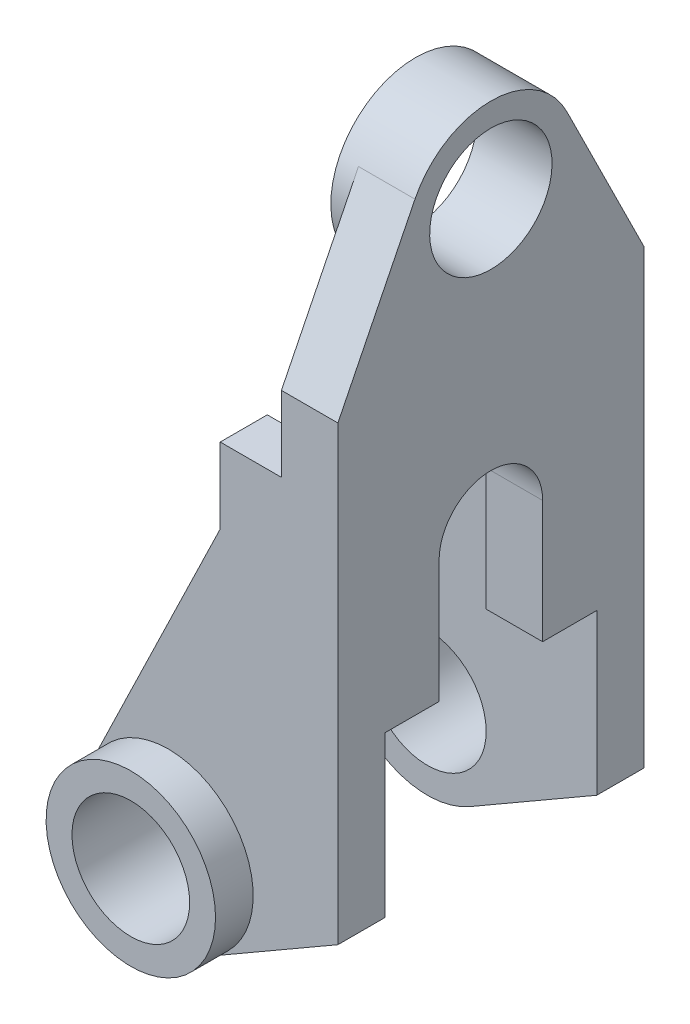
ISO-10303-21;
HEADER;
FILE_DESCRIPTION(('STEP AP214'),'2;1');
FILE_NAME('part.step','',(''),(''),'','','');
FILE_SCHEMA(('AUTOMOTIVE_DESIGN { 1 0 10303 214 1 1 1 1 }'));
ENDSEC;
DATA;
#1=APPLICATION_CONTEXT('core data for automotive mechanical design processes');
#2=APPLICATION_PROTOCOL_DEFINITION('international standard','automotive_design',2000,#1);
#3=PRODUCT_CONTEXT('',#1,'mechanical');
#4=PRODUCT('Part','Part','',(#3));
#5=PRODUCT_RELATED_PRODUCT_CATEGORY('part','',(#4));
#6=PRODUCT_DEFINITION_FORMATION('','',#4);
#7=PRODUCT_DEFINITION_CONTEXT('part definition',#1,'design');
#8=PRODUCT_DEFINITION('design','',#6,#7);
#9=PRODUCT_DEFINITION_SHAPE('','',#8);
#10=(LENGTH_UNIT() NAMED_UNIT(*) SI_UNIT(.MILLI.,.METRE.));
#11=(NAMED_UNIT(*) PLANE_ANGLE_UNIT() SI_UNIT($,.RADIAN.));
#12=(NAMED_UNIT(*) SI_UNIT($,.STERADIAN.) SOLID_ANGLE_UNIT());
#13=UNCERTAINTY_MEASURE_WITH_UNIT(LENGTH_MEASURE(1.E-05),#10,'distance_accuracy_value','');
#14=(GEOMETRIC_REPRESENTATION_CONTEXT(3) GLOBAL_UNCERTAINTY_ASSIGNED_CONTEXT((#13)) GLOBAL_UNIT_ASSIGNED_CONTEXT((#10,
#11,#12)) REPRESENTATION_CONTEXT('',''));
#15=CARTESIAN_POINT('',(0.,0.,0.));
#16=DIRECTION('',(0.,0.,1.));
#17=DIRECTION('',(1.,0.,0.));
#18=AXIS2_PLACEMENT_3D('',#15,#16,#17);
#19=CARTESIAN_POINT('',(27.1996168539313,72.1531908532306,5.));
#20=DIRECTION('',(0.,-1.,0.));
#21=DIRECTION('',(1.,0.,0.));
#22=AXIS2_PLACEMENT_3D('',#19,#20,#21);
#23=PLANE('',#22);
#24=DIRECTION('',(0.,0.,1.));
#25=VECTOR('',#24,1.);
#26=CARTESIAN_POINT('',(40.1996168539313,72.1531908532306,0.));
#27=LINE('',#26,#25);
#28=CARTESIAN_POINT('',(40.1996168539313,72.1531908532306,-5.));
#29=VERTEX_POINT('',#28);
#30=CARTESIAN_POINT('',(40.1996168539313,72.1531908532306,5.));
#31=VERTEX_POINT('',#30);
#32=EDGE_CURVE('E339',#29,#31,#27,.T.);
#33=ORIENTED_EDGE('',*,*,#32,.F.);
#34=DIRECTION('',(-1.,0.,0.));
#35=VECTOR('',#34,1.);
#36=CARTESIAN_POINT('',(27.1996168539313,72.1531908532306,-5.));
#37=LINE('',#36,#35);
#38=CARTESIAN_POINT('',(27.1996168539313,72.1531908532306,-5.));
#39=VERTEX_POINT('',#38);
#40=EDGE_CURVE('E421',#29,#39,#37,.T.);
#41=ORIENTED_EDGE('',*,*,#40,.T.);
#42=DIRECTION('',(0.,0.,-1.));
#43=VECTOR('',#42,1.);
#44=CARTESIAN_POINT('',(27.1996168539313,72.1531908532306,5.));
#45=LINE('',#44,#43);
#46=CARTESIAN_POINT('',(27.1996168539313,72.1531908532306,5.));
#47=VERTEX_POINT('',#46);
#48=EDGE_CURVE('E429',#47,#39,#45,.T.);
#49=ORIENTED_EDGE('',*,*,#48,.F.);
#50=DIRECTION('',(-1.,0.,0.));
#51=VECTOR('',#50,1.);
#52=CARTESIAN_POINT('',(27.1996168539313,72.1531908532306,5.));
#53=LINE('',#52,#51);
#54=EDGE_CURVE('E402',#31,#47,#53,.T.);
#55=ORIENTED_EDGE('',*,*,#54,.F.);
#56=EDGE_LOOP('',(#33,#41,#49,#55));
#57=FACE_BOUND('',#56,.T.);
#58=ADVANCED_FACE('F40',(#57),#23,.F.);
#59=CARTESIAN_POINT('',(27.1996168539313,56.1531908532306,5.));
#60=DIRECTION('',(0.899978714107295,-0.435933841487191,0.));
#61=DIRECTION('',(0.435933841487191,0.899978714107295,0.));
#62=AXIS2_PLACEMENT_3D('',#59,#60,#61);
#63=PLANE('',#62);
#64=DIRECTION('',(-0.435933841487191,-0.899978714107295,0.));
#65=VECTOR('',#64,1.);
#66=CARTESIAN_POINT('',(27.1996168539313,56.1531908532306,-5.));
#67=LINE('',#66,#65);
#68=CARTESIAN_POINT('',(27.1996168539313,56.1531908532306,-5.));
#69=VERTEX_POINT('',#68);
#70=CARTESIAN_POINT('',(0.,0.,-5.));
#71=VERTEX_POINT('',#70);
#72=EDGE_CURVE('E385',#69,#71,#67,.T.);
#73=ORIENTED_EDGE('',*,*,#72,.T.);
#74=DIRECTION('',(0.,0.,-1.));
#75=VECTOR('',#74,1.);
#76=CARTESIAN_POINT('',(0.,0.,5.));
#77=LINE('',#76,#75);
#78=CARTESIAN_POINT('',(0.,0.,5.));
#79=VERTEX_POINT('',#78);
#80=EDGE_CURVE('E390',#79,#71,#77,.T.);
#81=ORIENTED_EDGE('',*,*,#80,.F.);
#82=DIRECTION('',(-0.435933841487191,-0.899978714107295,0.));
#83=VECTOR('',#82,1.);
#84=CARTESIAN_POINT('',(27.1996168539313,56.1531908532306,5.));
#85=LINE('',#84,#83);
#86=CARTESIAN_POINT('',(27.1996168539313,56.1531908532306,5.));
#87=VERTEX_POINT('',#86);
#88=EDGE_CURVE('E391',#87,#79,#85,.T.);
#89=ORIENTED_EDGE('',*,*,#88,.F.);
#90=DIRECTION('',(0.,0.,-1.));
#91=VECTOR('',#90,1.);
#92=CARTESIAN_POINT('',(27.1996168539313,56.1531908532306,5.));
#93=LINE('',#92,#91);
#94=EDGE_CURVE('E408',#87,#69,#93,.T.);
#95=ORIENTED_EDGE('',*,*,#94,.T.);
#96=EDGE_LOOP('',(#73,#81,#89,#95));
#97=FACE_BOUND('',#96,.T.);
#98=ADVANCED_FACE('F42',(#97),#63,.F.);
#99=CARTESIAN_POINT('',(16.1996168539313,-7.84680914676944,5.));
#100=DIRECTION('',(0.,0.,-1.));
#101=DIRECTION('',(-1.,0.,0.));
#102=AXIS2_PLACEMENT_3D('',#99,#100,#101);
#103=CYLINDRICAL_SURFACE('',#102,18.);
#104=CARTESIAN_POINT('',(16.1996168539313,-7.84680914676944,-5.));
#105=DIRECTION('',(0.,0.,1.));
#106=DIRECTION('',(-1.,0.,0.));
#107=AXIS2_PLACEMENT_3D('',#104,#105,#106);
#108=CIRCLE('',#107,18.);
#109=CARTESIAN_POINT('',(25.1996168539313,-23.4352664148893,-5.));
#110=VERTEX_POINT('',#109);
#111=EDGE_CURVE('E412',#71,#110,#108,.T.);
#112=ORIENTED_EDGE('',*,*,#111,.T.);
#113=DIRECTION('',(0.,0.,-1.));
#114=VECTOR('',#113,1.);
#115=CARTESIAN_POINT('',(25.1996168539313,-23.4352664148893,5.));
#116=LINE('',#115,#114);
#117=CARTESIAN_POINT('',(25.1996168539313,-23.4352664148893,5.));
#118=VERTEX_POINT('',#117);
#119=EDGE_CURVE('E437',#118,#110,#116,.T.);
#120=ORIENTED_EDGE('',*,*,#119,.F.);
#121=CARTESIAN_POINT('',(16.1996168539313,-7.84680914676944,5.));
#122=DIRECTION('',(0.,0.,1.));
#123=DIRECTION('',(1.,0.,0.));
#124=AXIS2_PLACEMENT_3D('',#121,#122,#123);
#125=CIRCLE('',#124,18.);
#126=EDGE_CURVE('E386',#118,#79,#125,.T.);
#127=ORIENTED_EDGE('',*,*,#126,.T.);
#128=ORIENTED_EDGE('',*,*,#80,.T.);
#129=EDGE_LOOP('',(#112,#120,#127,#128));
#130=FACE_BOUND('',#129,.T.);
#131=CARTESIAN_POINT('',(16.1996168539313,-7.84680914676944,13.));
#132=DIRECTION('',(0.,0.,1.));
#133=DIRECTION('',(1.,0.,0.));
#134=AXIS2_PLACEMENT_3D('',#131,#132,#133);
#135=CIRCLE('',#134,18.);
#136=CARTESIAN_POINT('',(34.1996168539313,-7.84680914676944,13.));
#137=VERTEX_POINT('',#136);
#138=EDGE_CURVE('E381',#137,#137,#135,.T.);
#139=ORIENTED_EDGE('',*,*,#138,.F.);
#140=EDGE_LOOP('',(#139));
#141=FACE_BOUND('',#140,.T.);
#142=ADVANCED_FACE('F444',(#130,#141),#103,.T.);
#143=CARTESIAN_POINT('',(52.1996168539313,-7.84680914676944,5.));
#144=DIRECTION('',(-0.5,0.866025403784439,0.));
#145=DIRECTION('',(-0.866025403784439,-0.5,0.));
#146=AXIS2_PLACEMENT_3D('',#143,#144,#145);
#147=PLANE('',#146);
#148=DIRECTION('',(0.866025403784438,0.5,0.));
#149=VECTOR('',#148,1.);
#150=CARTESIAN_POINT('',(52.1996168539313,-7.84680914676944,-5.));
#151=LINE('',#150,#149);
#152=CARTESIAN_POINT('',(52.1996168539313,-7.84680914676944,-5.));
#153=VERTEX_POINT('',#152);
#154=EDGE_CURVE('E415',#110,#153,#151,.T.);
#155=ORIENTED_EDGE('',*,*,#154,.T.);
#156=DIRECTION('',(0.,0.,-1.));
#157=VECTOR('',#156,1.);
#158=CARTESIAN_POINT('',(52.1996168539313,-7.84680914676944,5.));
#159=LINE('',#158,#157);
#160=CARTESIAN_POINT('',(52.1996168539313,-7.84680914676944,5.));
#161=VERTEX_POINT('',#160);
#162=EDGE_CURVE('E433',#161,#153,#159,.T.);
#163=ORIENTED_EDGE('',*,*,#162,.F.);
#164=DIRECTION('',(0.866025403784438,0.5,0.));
#165=VECTOR('',#164,1.);
#166=CARTESIAN_POINT('',(52.1996168539313,-7.84680914676944,5.));
#167=LINE('',#166,#165);
#168=EDGE_CURVE('E395',#118,#161,#167,.T.);
#169=ORIENTED_EDGE('',*,*,#168,.F.);
#170=ORIENTED_EDGE('',*,*,#119,.T.);
#171=EDGE_LOOP('',(#155,#163,#169,#170));
#172=FACE_BOUND('',#171,.T.);
#173=ADVANCED_FACE('F457',(#172),#147,.F.);
#174=CARTESIAN_POINT('',(52.1996168539313,72.1531908532306,5.));
#175=DIRECTION('',(-1.,0.,0.));
#176=DIRECTION('',(0.,-1.,0.));
#177=AXIS2_PLACEMENT_3D('',#174,#175,#176);
#178=PLANE('',#177);
#179=DIRECTION('',(0.,1.,0.));
#180=VECTOR('',#179,1.);
#181=CARTESIAN_POINT('',(52.1996168539313,72.1531908532306,-5.));
#182=LINE('',#181,#180);
#183=CARTESIAN_POINT('',(52.1996168539313,26.1531908532306,-5.));
#184=VERTEX_POINT('',#183);
#185=EDGE_CURVE('E418',#153,#184,#182,.T.);
#186=ORIENTED_EDGE('',*,*,#185,.T.);
#187=DIRECTION('',(0.,0.,-1.));
#188=VECTOR('',#187,1.);
#189=CARTESIAN_POINT('',(52.1996168539313,26.1531908532306,-5.));
#190=LINE('',#189,#188);
#191=CARTESIAN_POINT('',(52.1996168539313,26.1531908532306,-16.5));
#192=VERTEX_POINT('',#191);
#193=EDGE_CURVE('E254',#184,#192,#190,.T.);
#194=ORIENTED_EDGE('',*,*,#193,.T.);
#195=DIRECTION('',(0.,1.,0.));
#196=VECTOR('',#195,1.);
#197=CARTESIAN_POINT('',(52.1996168539313,52.1531908532306,-16.5));
#198=LINE('',#197,#196);
#199=CARTESIAN_POINT('',(52.1996168539313,52.1531908532306,-16.5));
#200=VERTEX_POINT('',#199);
#201=EDGE_CURVE('E892',#192,#200,#198,.T.);
#202=ORIENTED_EDGE('',*,*,#201,.T.);
#203=CARTESIAN_POINT('',(52.1996168539313,52.1531908532306,-27.5));
#204=DIRECTION('',(-1.,0.,0.));
#205=DIRECTION('',(0.,-1.,0.));
#206=AXIS2_PLACEMENT_3D('',#203,#204,#205);
#207=CIRCLE('',#206,11.);
#208=CARTESIAN_POINT('',(52.1996168539313,52.1531908532306,-38.5));
#209=VERTEX_POINT('',#208);
#210=EDGE_CURVE('E888',#200,#209,#207,.T.);
#211=ORIENTED_EDGE('',*,*,#210,.T.);
#212=DIRECTION('',(0.,-1.,0.));
#213=VECTOR('',#212,1.);
#214=CARTESIAN_POINT('',(52.1996168539313,26.1531908532306,-38.5));
#215=LINE('',#214,#213);
#216=CARTESIAN_POINT('',(52.1996168539313,26.1531908532306,-38.5));
#217=VERTEX_POINT('',#216);
#218=EDGE_CURVE('E893',#209,#217,#215,.T.);
#219=ORIENTED_EDGE('',*,*,#218,.T.);
#220=DIRECTION('',(0.,0.,-1.));
#221=VECTOR('',#220,1.);
#222=CARTESIAN_POINT('',(52.1996168539313,26.1531908532306,-38.5));
#223=LINE('',#222,#221);
#224=CARTESIAN_POINT('',(52.1996168539313,26.1531908532306,-50.));
#225=VERTEX_POINT('',#224);
#226=EDGE_CURVE('E199',#217,#225,#223,.T.);
#227=ORIENTED_EDGE('',*,*,#226,.T.);
#228=DIRECTION('',(0.,1.,0.));
#229=VECTOR('',#228,1.);
#230=CARTESIAN_POINT('',(52.1996168539313,72.1531908532306,-50.));
#231=LINE('',#230,#229);
#232=CARTESIAN_POINT('',(52.1996168539313,-7.84680914676944,-50.));
#233=VERTEX_POINT('',#232);
#234=EDGE_CURVE('E290',#233,#225,#231,.T.);
#235=ORIENTED_EDGE('',*,*,#234,.F.);
#236=DIRECTION('',(0.,0.,1.));
#237=VECTOR('',#236,1.);
#238=CARTESIAN_POINT('',(52.1996168539313,-7.84680914676944,-60.));
#239=LINE('',#238,#237);
#240=CARTESIAN_POINT('',(52.1996168539313,-7.84680914676944,-60.));
#241=VERTEX_POINT('',#240);
#242=EDGE_CURVE('E305',#241,#233,#239,.T.);
#243=ORIENTED_EDGE('',*,*,#242,.F.);
#244=DIRECTION('',(0.,-1.,0.));
#245=VECTOR('',#244,1.);
#246=CARTESIAN_POINT('',(52.1996168539313,0.,-60.));
#247=LINE('',#246,#245);
#248=CARTESIAN_POINT('',(52.1996168539313,88.1531908532306,-60.));
#249=VERTEX_POINT('',#248);
#250=EDGE_CURVE('E355',#249,#241,#247,.T.);
#251=ORIENTED_EDGE('',*,*,#250,.F.);
#252=DIRECTION('',(0.,0.895775078655424,0.444507602252052));
#253=VECTOR('',#252,1.);
#254=CARTESIAN_POINT('',(52.1996168539313,41.3086552090976,-83.2455140960605));
#255=LINE('',#254,#253);
#256=CARTESIAN_POINT('',(52.1996168539313,121.154327693768,-43.6239514157976));
#257=VERTEX_POINT('',#256);
#258=EDGE_CURVE('E323',#249,#257,#255,.T.);
#259=ORIENTED_EDGE('',*,*,#258,.T.);
#260=CARTESIAN_POINT('',(52.1996168539313,113.153190853231,-27.5));
#261=DIRECTION('',(1.,0.,0.));
#262=DIRECTION('',(0.,1.,0.));
#263=AXIS2_PLACEMENT_3D('',#260,#261,#262);
#264=CIRCLE('',#263,18.);
#265=CARTESIAN_POINT('',(52.1996168539313,121.154327693768,-11.3760485842024));
#266=VERTEX_POINT('',#265);
#267=EDGE_CURVE('E347',#266,#257,#264,.F.);
#268=ORIENTED_EDGE('',*,*,#267,.F.);
#269=DIRECTION('',(0.,-0.895775078655425,0.444507602252052));
#270=VECTOR('',#269,1.);
#271=CARTESIAN_POINT('',(52.1996168539313,19.408819428733,39.1127995613532));
#272=LINE('',#271,#270);
#273=CARTESIAN_POINT('',(52.1996168539313,88.1531908532306,5.));
#274=VERTEX_POINT('',#273);
#275=EDGE_CURVE('E351',#266,#274,#272,.T.);
#276=ORIENTED_EDGE('',*,*,#275,.T.);
#277=DIRECTION('',(0.,1.,0.));
#278=VECTOR('',#277,1.);
#279=CARTESIAN_POINT('',(52.1996168539313,72.1531908532306,5.));
#280=LINE('',#279,#278);
#281=EDGE_CURVE('E399',#161,#274,#280,.T.);
#282=ORIENTED_EDGE('',*,*,#281,.F.);
#283=ORIENTED_EDGE('',*,*,#162,.T.);
#284=EDGE_LOOP('',(#186,#194,#202,#211,#219,#227,#235,#243,#251,#259,#268,#276,#282,#283));
#285=FACE_BOUND('',#284,.T.);
#286=CARTESIAN_POINT('',(52.1996168539313,113.153190853231,-27.5));
#287=DIRECTION('',(1.,0.,0.));
#288=DIRECTION('',(0.,1.,0.));
#289=AXIS2_PLACEMENT_3D('',#286,#287,#288);
#290=CIRCLE('',#289,13.);
#291=CARTESIAN_POINT('',(52.1996168539313,126.153190853231,-27.5));
#292=VERTEX_POINT('',#291);
#293=EDGE_CURVE('E328',#292,#292,#290,.T.);
#294=ORIENTED_EDGE('',*,*,#293,.F.);
#295=EDGE_LOOP('',(#294));
#296=FACE_BOUND('',#295,.T.);
#297=ADVANCED_FACE('F461',(#285,#296),#178,.F.);
#298=CARTESIAN_POINT('',(27.1996168539313,56.1531908532306,5.));
#299=DIRECTION('',(1.,0.,0.));
#300=DIRECTION('',(0.,0.,-1.));
#301=AXIS2_PLACEMENT_3D('',#298,#299,#300);
#302=PLANE('',#301);
#303=DIRECTION('',(0.,-1.,0.));
#304=VECTOR('',#303,1.);
#305=CARTESIAN_POINT('',(27.1996168539313,56.1531908532306,-5.));
#306=LINE('',#305,#304);
#307=EDGE_CURVE('E396',#39,#69,#306,.T.);
#308=ORIENTED_EDGE('',*,*,#307,.T.);
#309=ORIENTED_EDGE('',*,*,#94,.F.);
#310=DIRECTION('',(0.,-1.,0.));
#311=VECTOR('',#310,1.);
#312=CARTESIAN_POINT('',(27.1996168539313,56.1531908532306,5.));
#313=LINE('',#312,#311);
#314=EDGE_CURVE('E405',#47,#87,#313,.T.);
#315=ORIENTED_EDGE('',*,*,#314,.F.);
#316=ORIENTED_EDGE('',*,*,#48,.T.);
#317=EDGE_LOOP('',(#308,#309,#315,#316));
#318=FACE_BOUND('',#317,.T.);
#319=ADVANCED_FACE('F488',(#318),#302,.F.);
#320=CARTESIAN_POINT('',(16.1996168539313,-7.84680914676944,5.));
#321=DIRECTION('',(0.,0.,-1.));
#322=DIRECTION('',(-1.,0.,0.));
#323=AXIS2_PLACEMENT_3D('',#320,#321,#322);
#324=PLANE('',#323);
#325=ORIENTED_EDGE('',*,*,#126,.F.);
#326=ORIENTED_EDGE('',*,*,#168,.T.);
#327=ORIENTED_EDGE('',*,*,#281,.T.);
#328=DIRECTION('',(1.,0.,0.));
#329=VECTOR('',#328,1.);
#330=CARTESIAN_POINT('',(40.1996168539313,88.1531908532306,5.));
#331=LINE('',#330,#329);
#332=CARTESIAN_POINT('',(40.1996168539313,88.1531908532306,5.));
#333=VERTEX_POINT('',#332);
#334=EDGE_CURVE('E365',#333,#274,#331,.T.);
#335=ORIENTED_EDGE('',*,*,#334,.F.);
#336=DIRECTION('',(0.,1.,0.));
#337=VECTOR('',#336,1.);
#338=CARTESIAN_POINT('',(40.1996168539313,0.,5.));
#339=LINE('',#338,#337);
#340=EDGE_CURVE('E332',#31,#333,#339,.T.);
#341=ORIENTED_EDGE('',*,*,#340,.F.);
#342=ORIENTED_EDGE('',*,*,#54,.T.);
#343=ORIENTED_EDGE('',*,*,#314,.T.);
#344=ORIENTED_EDGE('',*,*,#88,.T.);
#345=EDGE_LOOP('',(#325,#326,#327,#335,#341,#342,#343,#344));
#346=FACE_BOUND('',#345,.T.);
#347=ADVANCED_FACE('F468',(#346),#324,.F.);
#348=CARTESIAN_POINT('',(16.1996168539313,-7.84680914676944,-5.));
#349=DIRECTION('',(0.,0.,-1.));
#350=DIRECTION('',(-1.,0.,0.));
#351=AXIS2_PLACEMENT_3D('',#348,#349,#350);
#352=PLANE('',#351);
#353=DIRECTION('',(-1.,0.,0.));
#354=VECTOR('',#353,1.);
#355=CARTESIAN_POINT('',(116.550219026716,26.1531908532306,-5.));
#356=LINE('',#355,#354);
#357=CARTESIAN_POINT('',(40.1996168539313,26.1531908532306,-5.));
#358=VERTEX_POINT('',#357);
#359=EDGE_CURVE('E61',#184,#358,#356,.T.);
#360=ORIENTED_EDGE('',*,*,#359,.F.);
#361=ORIENTED_EDGE('',*,*,#185,.F.);
#362=ORIENTED_EDGE('',*,*,#154,.F.);
#363=ORIENTED_EDGE('',*,*,#111,.F.);
#364=ORIENTED_EDGE('',*,*,#72,.F.);
#365=ORIENTED_EDGE('',*,*,#307,.F.);
#366=ORIENTED_EDGE('',*,*,#40,.F.);
#367=DIRECTION('',(0.,1.,0.));
#368=VECTOR('',#367,1.);
#369=CARTESIAN_POINT('',(40.1996168539313,72.1531908532306,-5.));
#370=LINE('',#369,#368);
#371=EDGE_CURVE('E57',#358,#29,#370,.T.);
#372=ORIENTED_EDGE('',*,*,#371,.F.);
#373=EDGE_LOOP('',(#360,#361,#362,#363,#364,#365,#366,#372));
#374=FACE_BOUND('',#373,.T.);
#375=CARTESIAN_POINT('',(16.1996168539313,-7.84680914676944,-5.));
#376=DIRECTION('',(0.,0.,-1.));
#377=DIRECTION('',(-1.,0.,0.));
#378=AXIS2_PLACEMENT_3D('',#375,#376,#377);
#379=CIRCLE('',#378,12.5);
#380=CARTESIAN_POINT('',(3.69961685393132,-7.84680914676944,-5.));
#381=VERTEX_POINT('',#380);
#382=EDGE_CURVE('E364',#381,#381,#379,.F.);
#383=ORIENTED_EDGE('',*,*,#382,.T.);
#384=EDGE_LOOP('',(#383));
#385=FACE_BOUND('',#384,.T.);
#386=ADVANCED_FACE('F452',(#374,#385),#352,.T.);
#387=CARTESIAN_POINT('',(16.1996168539313,-7.84680914676944,13.));
#388=DIRECTION('',(0.,0.,-1.));
#389=DIRECTION('',(-1.,0.,0.));
#390=AXIS2_PLACEMENT_3D('',#387,#388,#389);
#391=CYLINDRICAL_SURFACE('',#390,12.5);
#392=CARTESIAN_POINT('',(16.1996168539313,-7.84680914676944,13.));
#393=DIRECTION('',(0.,0.,1.));
#394=DIRECTION('',(1.,0.,0.));
#395=AXIS2_PLACEMENT_3D('',#392,#393,#394);
#396=CIRCLE('',#395,12.5);
#397=CARTESIAN_POINT('',(28.6996168539313,-7.84680914676944,13.));
#398=VERTEX_POINT('',#397);
#399=EDGE_CURVE('E377',#398,#398,#396,.T.);
#400=ORIENTED_EDGE('',*,*,#399,.T.);
#401=EDGE_LOOP('',(#400));
#402=FACE_BOUND('',#401,.T.);
#403=ORIENTED_EDGE('',*,*,#382,.F.);
#404=EDGE_LOOP('',(#403));
#405=FACE_BOUND('',#404,.T.);
#406=ADVANCED_FACE('F541',(#402,#405),#391,.F.);
#407=CARTESIAN_POINT('',(0.,0.,13.));
#408=DIRECTION('',(0.,0.,1.));
#409=DIRECTION('',(1.,0.,0.));
#410=AXIS2_PLACEMENT_3D('',#407,#408,#409);
#411=PLANE('',#410);
#412=ORIENTED_EDGE('',*,*,#399,.F.);
#413=EDGE_LOOP('',(#412));
#414=FACE_BOUND('',#413,.T.);
#415=ORIENTED_EDGE('',*,*,#138,.T.);
#416=EDGE_LOOP('',(#415));
#417=FACE_BOUND('',#416,.T.);
#418=ADVANCED_FACE('F549',(#414,#417),#411,.T.);
#419=CARTESIAN_POINT('',(40.1996168539313,41.3086552090976,-83.2455140960605));
#420=DIRECTION('',(0.,0.444507602252052,-0.895775078655424));
#421=DIRECTION('',(0.,0.895775078655424,0.444507602252052));
#422=AXIS2_PLACEMENT_3D('',#419,#420,#421);
#423=PLANE('',#422);
#424=ORIENTED_EDGE('',*,*,#258,.F.);
#425=DIRECTION('',(1.,0.,0.));
#426=VECTOR('',#425,1.);
#427=CARTESIAN_POINT('',(40.1996168539313,88.1531908532306,-60.));
#428=LINE('',#427,#426);
#429=CARTESIAN_POINT('',(40.1996168539313,88.1531908532306,-60.));
#430=VERTEX_POINT('',#429);
#431=EDGE_CURVE('E361',#430,#249,#428,.T.);
#432=ORIENTED_EDGE('',*,*,#431,.F.);
#433=DIRECTION('',(0.,0.895775078655424,0.444507602252052));
#434=VECTOR('',#433,1.);
#435=CARTESIAN_POINT('',(40.1996168539313,41.3086552090976,-83.2455140960605));
#436=LINE('',#435,#434);
#437=CARTESIAN_POINT('',(40.1996168539313,121.154327693768,-43.6239514157976));
#438=VERTEX_POINT('',#437);
#439=EDGE_CURVE('E324',#430,#438,#436,.T.);
#440=ORIENTED_EDGE('',*,*,#439,.T.);
#441=DIRECTION('',(1.,0.,0.));
#442=VECTOR('',#441,1.);
#443=CARTESIAN_POINT('',(40.1996168539313,121.154327693768,-43.6239514157976));
#444=LINE('',#443,#442);
#445=EDGE_CURVE('E343',#438,#257,#444,.T.);
#446=ORIENTED_EDGE('',*,*,#445,.T.);
#447=EDGE_LOOP('',(#424,#432,#440,#446));
#448=FACE_BOUND('',#447,.T.);
#449=ADVANCED_FACE('F559',(#448),#423,.T.);
#450=CARTESIAN_POINT('',(40.1996168539313,0.,-60.));
#451=DIRECTION('',(0.,0.,1.));
#452=DIRECTION('',(1.,0.,0.));
#453=AXIS2_PLACEMENT_3D('',#450,#451,#452);
#454=PLANE('',#453);
#455=DIRECTION('',(0.866025403784438,0.5,0.));
#456=VECTOR('',#455,1.);
#457=CARTESIAN_POINT('',(52.1996168539313,-7.84680914676944,-60.));
#458=LINE('',#457,#456);
#459=CARTESIAN_POINT('',(25.1996168539313,-23.4352664148893,-60.));
#460=VERTEX_POINT('',#459);
#461=EDGE_CURVE('E275',#460,#241,#458,.T.);
#462=ORIENTED_EDGE('',*,*,#461,.F.);
#463=CARTESIAN_POINT('',(16.1996168539313,-7.84680914676944,-60.));
#464=DIRECTION('',(0.,0.,1.));
#465=DIRECTION('',(1.,0.,0.));
#466=AXIS2_PLACEMENT_3D('',#463,#464,#465);
#467=CIRCLE('',#466,18.);
#468=CARTESIAN_POINT('',(0.,0.,-60.));
#469=VERTEX_POINT('',#468);
#470=EDGE_CURVE('E11',#460,#469,#467,.T.);
#471=ORIENTED_EDGE('',*,*,#470,.T.);
#472=DIRECTION('',(-0.435933841487191,-0.899978714107295,0.));
#473=VECTOR('',#472,1.);
#474=CARTESIAN_POINT('',(27.1996168539313,56.1531908532306,-60.));
#475=LINE('',#474,#473);
#476=CARTESIAN_POINT('',(27.1996168539313,56.1531908532306,-60.));
#477=VERTEX_POINT('',#476);
#478=EDGE_CURVE('E263',#477,#469,#475,.T.);
#479=ORIENTED_EDGE('',*,*,#478,.F.);
#480=DIRECTION('',(0.,-1.,0.));
#481=VECTOR('',#480,1.);
#482=CARTESIAN_POINT('',(27.1996168539313,56.1531908532306,-60.));
#483=LINE('',#482,#481);
#484=CARTESIAN_POINT('',(27.1996168539313,72.1531908532306,-60.));
#485=VERTEX_POINT('',#484);
#486=EDGE_CURVE('E267',#485,#477,#483,.T.);
#487=ORIENTED_EDGE('',*,*,#486,.F.);
#488=DIRECTION('',(-1.,0.,0.));
#489=VECTOR('',#488,1.);
#490=CARTESIAN_POINT('',(27.1996168539313,72.1531908532306,-60.));
#491=LINE('',#490,#489);
#492=CARTESIAN_POINT('',(40.1996168539313,72.1531908532306,-60.));
#493=VERTEX_POINT('',#492);
#494=EDGE_CURVE('E272',#493,#485,#491,.T.);
#495=ORIENTED_EDGE('',*,*,#494,.F.);
#496=DIRECTION('',(0.,-1.,0.));
#497=VECTOR('',#496,1.);
#498=CARTESIAN_POINT('',(40.1996168539313,0.,-60.));
#499=LINE('',#498,#497);
#500=EDGE_CURVE('E338',#430,#493,#499,.T.);
#501=ORIENTED_EDGE('',*,*,#500,.F.);
#502=ORIENTED_EDGE('',*,*,#431,.T.);
#503=ORIENTED_EDGE('',*,*,#250,.T.);
#504=EDGE_LOOP('',(#462,#471,#479,#487,#495,#501,#502,#503));
#505=FACE_BOUND('',#504,.T.);
#506=ADVANCED_FACE('F568',(#505),#454,.F.);
#507=CARTESIAN_POINT('',(40.1996168539313,19.408819428733,39.1127995613532));
#508=DIRECTION('',(0.,0.444507602252052,0.895775078655424));
#509=DIRECTION('',(0.,-0.895775078655425,0.444507602252052));
#510=AXIS2_PLACEMENT_3D('',#507,#508,#509);
#511=PLANE('',#510);
#512=ORIENTED_EDGE('',*,*,#275,.F.);
#513=DIRECTION('',(1.,0.,0.));
#514=VECTOR('',#513,1.);
#515=CARTESIAN_POINT('',(40.1996168539313,121.154327693768,-11.3760485842024));
#516=LINE('',#515,#514);
#517=CARTESIAN_POINT('',(40.1996168539313,121.154327693768,-11.3760485842024));
#518=VERTEX_POINT('',#517);
#519=EDGE_CURVE('E369',#518,#266,#516,.T.);
#520=ORIENTED_EDGE('',*,*,#519,.F.);
#521=DIRECTION('',(0.,-0.895775078655425,0.444507602252052));
#522=VECTOR('',#521,1.);
#523=CARTESIAN_POINT('',(40.1996168539313,19.408819428733,39.1127995613532));
#524=LINE('',#523,#522);
#525=EDGE_CURVE('E327',#518,#333,#524,.T.);
#526=ORIENTED_EDGE('',*,*,#525,.T.);
#527=ORIENTED_EDGE('',*,*,#334,.T.);
#528=EDGE_LOOP('',(#512,#520,#526,#527));
#529=FACE_BOUND('',#528,.T.);
#530=ADVANCED_FACE('F471',(#529),#511,.T.);
#531=CARTESIAN_POINT('',(40.1996168539313,113.153190853231,-27.5));
#532=DIRECTION('',(1.,0.,0.));
#533=DIRECTION('',(0.,1.,0.));
#534=AXIS2_PLACEMENT_3D('',#531,#532,#533);
#535=CYLINDRICAL_SURFACE('',#534,18.);
#536=ORIENTED_EDGE('',*,*,#267,.T.);
#537=ORIENTED_EDGE('',*,*,#445,.F.);
#538=CARTESIAN_POINT('',(40.1996168539313,113.153190853231,-27.5));
#539=DIRECTION('',(1.,0.,0.));
#540=DIRECTION('',(0.,1.,0.));
#541=AXIS2_PLACEMENT_3D('',#538,#539,#540);
#542=CIRCLE('',#541,18.);
#543=EDGE_CURVE('E44',#518,#438,#542,.T.);
#544=ORIENTED_EDGE('',*,*,#543,.F.);
#545=ORIENTED_EDGE('',*,*,#519,.T.);
#546=EDGE_LOOP('',(#536,#537,#544,#545));
#547=FACE_BOUND('',#546,.T.);
#548=CARTESIAN_POINT('',(36.1996168539313,113.153190853231,-27.5));
#549=DIRECTION('',(1.,0.,0.));
#550=DIRECTION('',(0.,1.,0.));
#551=AXIS2_PLACEMENT_3D('',#548,#549,#550);
#552=CIRCLE('',#551,18.);
#553=CARTESIAN_POINT('',(36.1996168539313,131.153190853231,-27.5));
#554=VERTEX_POINT('',#553);
#555=EDGE_CURVE('E319',#554,#554,#552,.T.);
#556=ORIENTED_EDGE('',*,*,#555,.T.);
#557=EDGE_LOOP('',(#556));
#558=FACE_BOUND('',#557,.T.);
#559=ADVANCED_FACE('F478',(#547,#558),#535,.T.);
#560=CARTESIAN_POINT('',(40.1996168539313,113.153190853231,-27.5));
#561=DIRECTION('',(1.,0.,0.));
#562=DIRECTION('',(0.,1.,0.));
#563=AXIS2_PLACEMENT_3D('',#560,#561,#562);
#564=CYLINDRICAL_SURFACE('',#563,13.);
#565=ORIENTED_EDGE('',*,*,#293,.T.);
#566=EDGE_LOOP('',(#565));
#567=FACE_BOUND('',#566,.T.);
#568=CARTESIAN_POINT('',(36.1996168539313,113.153190853231,-27.5));
#569=DIRECTION('',(1.,0.,0.));
#570=DIRECTION('',(0.,1.,0.));
#571=AXIS2_PLACEMENT_3D('',#568,#569,#570);
#572=CIRCLE('',#571,13.);
#573=CARTESIAN_POINT('',(36.1996168539313,126.153190853231,-27.5));
#574=VERTEX_POINT('',#573);
#575=EDGE_CURVE('E315',#574,#574,#572,.T.);
#576=ORIENTED_EDGE('',*,*,#575,.F.);
#577=EDGE_LOOP('',(#576));
#578=FACE_BOUND('',#577,.T.);
#579=ADVANCED_FACE('F597',(#567,#578),#564,.F.);
#580=CARTESIAN_POINT('',(40.1996168539313,0.,0.));
#581=DIRECTION('',(1.,0.,0.));
#582=DIRECTION('',(0.,1.,0.));
#583=AXIS2_PLACEMENT_3D('',#580,#581,#582);
#584=PLANE('',#583);
#585=ORIENTED_EDGE('',*,*,#525,.F.);
#586=ORIENTED_EDGE('',*,*,#543,.T.);
#587=ORIENTED_EDGE('',*,*,#439,.F.);
#588=ORIENTED_EDGE('',*,*,#500,.T.);
#589=CARTESIAN_POINT('',(40.1996168539313,72.1531908532306,-50.));
#590=VERTEX_POINT('',#589);
#591=EDGE_CURVE('E335',#493,#590,#27,.T.);
#592=ORIENTED_EDGE('',*,*,#591,.T.);
#593=DIRECTION('',(0.,-1.,0.));
#594=VECTOR('',#593,1.);
#595=CARTESIAN_POINT('',(40.1996168539313,26.1531908532306,-50.));
#596=LINE('',#595,#594);
#597=CARTESIAN_POINT('',(40.1996168539313,26.1531908532306,-50.));
#598=VERTEX_POINT('',#597);
#599=EDGE_CURVE('E219',#590,#598,#596,.T.);
#600=ORIENTED_EDGE('',*,*,#599,.T.);
#601=DIRECTION('',(0.,0.,1.));
#602=VECTOR('',#601,1.);
#603=CARTESIAN_POINT('',(40.1996168539313,26.1531908532306,-38.5));
#604=LINE('',#603,#602);
#605=CARTESIAN_POINT('',(40.1996168539313,26.1531908532306,-38.5));
#606=VERTEX_POINT('',#605);
#607=EDGE_CURVE('E196',#598,#606,#604,.T.);
#608=ORIENTED_EDGE('',*,*,#607,.T.);
#609=DIRECTION('',(0.,1.,0.));
#610=VECTOR('',#609,1.);
#611=CARTESIAN_POINT('',(40.1996168539313,26.1531908532306,-38.5));
#612=LINE('',#611,#610);
#613=CARTESIAN_POINT('',(40.1996168539313,52.1531908532306,-38.5));
#614=VERTEX_POINT('',#613);
#615=EDGE_CURVE('E207',#606,#614,#612,.T.);
#616=ORIENTED_EDGE('',*,*,#615,.T.);
#617=CARTESIAN_POINT('',(40.1996168539313,52.1531908532306,-27.5));
#618=DIRECTION('',(1.,0.,0.));
#619=DIRECTION('',(0.,-1.,0.));
#620=AXIS2_PLACEMENT_3D('',#617,#618,#619);
#621=CIRCLE('',#620,11.);
#622=CARTESIAN_POINT('',(40.1996168539313,52.1531908532306,-16.5));
#623=VERTEX_POINT('',#622);
#624=EDGE_CURVE('E214',#614,#623,#621,.T.);
#625=ORIENTED_EDGE('',*,*,#624,.T.);
#626=DIRECTION('',(0.,-1.,0.));
#627=VECTOR('',#626,1.);
#628=CARTESIAN_POINT('',(40.1996168539313,52.1531908532306,-16.5));
#629=LINE('',#628,#627);
#630=CARTESIAN_POINT('',(40.1996168539313,26.1531908532306,-16.5));
#631=VERTEX_POINT('',#630);
#632=EDGE_CURVE('E229',#623,#631,#629,.T.);
#633=ORIENTED_EDGE('',*,*,#632,.T.);
#634=DIRECTION('',(0.,0.,1.));
#635=VECTOR('',#634,1.);
#636=CARTESIAN_POINT('',(40.1996168539313,26.1531908532306,-5.));
#637=LINE('',#636,#635);
#638=EDGE_CURVE('E233',#631,#358,#637,.T.);
#639=ORIENTED_EDGE('',*,*,#638,.T.);
#640=ORIENTED_EDGE('',*,*,#371,.T.);
#641=ORIENTED_EDGE('',*,*,#32,.T.);
#642=ORIENTED_EDGE('',*,*,#340,.T.);
#643=EDGE_LOOP('',(#585,#586,#587,#588,#592,#600,#608,#616,#625,#633,#639,#640,#641,#642));
#644=FACE_BOUND('',#643,.T.);
#645=ADVANCED_FACE('F217',(#644),#584,.F.);
#646=CARTESIAN_POINT('',(36.1996168539313,113.153190853231,-27.5));
#647=DIRECTION('',(1.,0.,0.));
#648=DIRECTION('',(0.,1.,0.));
#649=AXIS2_PLACEMENT_3D('',#646,#647,#648);
#650=PLANE('',#649);
#651=ORIENTED_EDGE('',*,*,#575,.T.);
#652=EDGE_LOOP('',(#651));
#653=FACE_BOUND('',#652,.T.);
#654=ORIENTED_EDGE('',*,*,#555,.F.);
#655=EDGE_LOOP('',(#654));
#656=FACE_BOUND('',#655,.T.);
#657=ADVANCED_FACE('F614',(#653,#656),#650,.F.);
#658=CARTESIAN_POINT('',(27.1996168539313,72.1531908532306,-60.));
#659=DIRECTION('',(0.,1.,0.));
#660=DIRECTION('',(-1.,0.,0.));
#661=AXIS2_PLACEMENT_3D('',#658,#659,#660);
#662=PLANE('',#661);
#663=ORIENTED_EDGE('',*,*,#591,.F.);
#664=ORIENTED_EDGE('',*,*,#494,.T.);
#665=DIRECTION('',(0.,0.,1.));
#666=VECTOR('',#665,1.);
#667=CARTESIAN_POINT('',(27.1996168539313,72.1531908532306,-60.));
#668=LINE('',#667,#666);
#669=CARTESIAN_POINT('',(27.1996168539313,72.1531908532306,-50.));
#670=VERTEX_POINT('',#669);
#671=EDGE_CURVE('E308',#485,#670,#668,.T.);
#672=ORIENTED_EDGE('',*,*,#671,.T.);
#673=DIRECTION('',(-1.,0.,0.));
#674=VECTOR('',#673,1.);
#675=CARTESIAN_POINT('',(27.1996168539313,72.1531908532306,-50.));
#676=LINE('',#675,#674);
#677=EDGE_CURVE('E287',#590,#670,#676,.T.);
#678=ORIENTED_EDGE('',*,*,#677,.F.);
#679=EDGE_LOOP('',(#663,#664,#672,#678));
#680=FACE_BOUND('',#679,.T.);
#681=ADVANCED_FACE('F623',(#680),#662,.T.);
#682=CARTESIAN_POINT('',(27.1996168539313,56.1531908532306,-60.));
#683=DIRECTION('',(-0.899978714107295,0.435933841487191,0.));
#684=DIRECTION('',(-0.435933841487191,-0.899978714107295,0.));
#685=AXIS2_PLACEMENT_3D('',#682,#683,#684);
#686=PLANE('',#685);
#687=DIRECTION('',(-0.435933841487191,-0.899978714107295,0.));
#688=VECTOR('',#687,1.);
#689=CARTESIAN_POINT('',(27.1996168539313,56.1531908532306,-50.));
#690=LINE('',#689,#688);
#691=CARTESIAN_POINT('',(27.1996168539313,56.1531908532306,-50.));
#692=VERTEX_POINT('',#691);
#693=CARTESIAN_POINT('',(0.,0.,-50.));
#694=VERTEX_POINT('',#693);
#695=EDGE_CURVE('E261',#692,#694,#690,.T.);
#696=ORIENTED_EDGE('',*,*,#695,.F.);
#697=DIRECTION('',(0.,0.,1.));
#698=VECTOR('',#697,1.);
#699=CARTESIAN_POINT('',(27.1996168539313,56.1531908532306,-60.));
#700=LINE('',#699,#698);
#701=EDGE_CURVE('E312',#477,#692,#700,.T.);
#702=ORIENTED_EDGE('',*,*,#701,.F.);
#703=ORIENTED_EDGE('',*,*,#478,.T.);
#704=DIRECTION('',(0.,0.,1.));
#705=VECTOR('',#704,1.);
#706=CARTESIAN_POINT('',(0.,0.,-60.));
#707=LINE('',#706,#705);
#708=EDGE_CURVE('E279',#469,#694,#707,.T.);
#709=ORIENTED_EDGE('',*,*,#708,.T.);
#710=EDGE_LOOP('',(#696,#702,#703,#709));
#711=FACE_BOUND('',#710,.T.);
#712=ADVANCED_FACE('F632',(#711),#686,.T.);
#713=CARTESIAN_POINT('',(27.1996168539313,56.1531908532306,-60.));
#714=DIRECTION('',(-1.,0.,0.));
#715=DIRECTION('',(0.,0.,1.));
#716=AXIS2_PLACEMENT_3D('',#713,#714,#715);
#717=PLANE('',#716);
#718=DIRECTION('',(0.,-1.,0.));
#719=VECTOR('',#718,1.);
#720=CARTESIAN_POINT('',(27.1996168539313,56.1531908532306,-50.));
#721=LINE('',#720,#719);
#722=EDGE_CURVE('E283',#670,#692,#721,.T.);
#723=ORIENTED_EDGE('',*,*,#722,.F.);
#724=ORIENTED_EDGE('',*,*,#671,.F.);
#725=ORIENTED_EDGE('',*,*,#486,.T.);
#726=ORIENTED_EDGE('',*,*,#701,.T.);
#727=EDGE_LOOP('',(#723,#724,#725,#726));
#728=FACE_BOUND('',#727,.T.);
#729=ADVANCED_FACE('F642',(#728),#717,.T.);
#730=CARTESIAN_POINT('',(52.1996168539313,-7.84680914676944,-60.));
#731=DIRECTION('',(0.5,-0.866025403784439,0.));
#732=DIRECTION('',(0.866025403784439,0.5,0.));
#733=AXIS2_PLACEMENT_3D('',#730,#731,#732);
#734=PLANE('',#733);
#735=DIRECTION('',(0.866025403784438,0.5,0.));
#736=VECTOR('',#735,1.);
#737=CARTESIAN_POINT('',(52.1996168539313,-7.84680914676944,-50.));
#738=LINE('',#737,#736);
#739=CARTESIAN_POINT('',(25.1996168539313,-23.4352664148893,-50.));
#740=VERTEX_POINT('',#739);
#741=EDGE_CURVE('E293',#740,#233,#738,.T.);
#742=ORIENTED_EDGE('',*,*,#741,.F.);
#743=DIRECTION('',(0.,0.,1.));
#744=VECTOR('',#743,1.);
#745=CARTESIAN_POINT('',(25.1996168539313,-23.4352664148893,-60.));
#746=LINE('',#745,#744);
#747=EDGE_CURVE('E302',#460,#740,#746,.T.);
#748=ORIENTED_EDGE('',*,*,#747,.F.);
#749=ORIENTED_EDGE('',*,*,#461,.T.);
#750=ORIENTED_EDGE('',*,*,#242,.T.);
#751=EDGE_LOOP('',(#742,#748,#749,#750));
#752=FACE_BOUND('',#751,.T.);
#753=ADVANCED_FACE('F652',(#752),#734,.T.);
#754=CARTESIAN_POINT('',(16.1996168539313,-7.84680914676944,-60.));
#755=DIRECTION('',(0.,0.,1.));
#756=DIRECTION('',(1.,0.,0.));
#757=AXIS2_PLACEMENT_3D('',#754,#755,#756);
#758=CYLINDRICAL_SURFACE('',#757,18.);
#759=CARTESIAN_POINT('',(16.1996168539313,-7.84680914676944,-50.));
#760=DIRECTION('',(0.,0.,1.));
#761=DIRECTION('',(-1.,0.,0.));
#762=AXIS2_PLACEMENT_3D('',#759,#760,#761);
#763=CIRCLE('',#762,18.);
#764=EDGE_CURVE('E268',#694,#740,#763,.T.);
#765=ORIENTED_EDGE('',*,*,#764,.F.);
#766=ORIENTED_EDGE('',*,*,#708,.F.);
#767=ORIENTED_EDGE('',*,*,#470,.F.);
#768=ORIENTED_EDGE('',*,*,#747,.T.);
#769=EDGE_LOOP('',(#765,#766,#767,#768));
#770=FACE_BOUND('',#769,.T.);
#771=CARTESIAN_POINT('',(16.1996168539313,-7.84680914676944,-68.));
#772=DIRECTION('',(0.,0.,1.));
#773=DIRECTION('',(1.,0.,0.));
#774=AXIS2_PLACEMENT_3D('',#771,#772,#773);
#775=CIRCLE('',#774,18.);
#776=CARTESIAN_POINT('',(34.1996168539313,-7.84680914676944,-68.));
#777=VERTEX_POINT('',#776);
#778=EDGE_CURVE('E258',#777,#777,#775,.T.);
#779=ORIENTED_EDGE('',*,*,#778,.T.);
#780=EDGE_LOOP('',(#779));
#781=FACE_BOUND('',#780,.T.);
#782=ADVANCED_FACE('F662',(#770,#781),#758,.T.);
#783=CARTESIAN_POINT('',(16.1996168539313,-7.84680914676944,-50.));
#784=DIRECTION('',(0.,0.,1.));
#785=DIRECTION('',(-1.,0.,0.));
#786=AXIS2_PLACEMENT_3D('',#783,#784,#785);
#787=PLANE('',#786);
#788=DIRECTION('',(-1.,0.,0.));
#789=VECTOR('',#788,1.);
#790=CARTESIAN_POINT('',(116.550219026716,26.1531908532306,-50.));
#791=LINE('',#790,#789);
#792=EDGE_CURVE('E204',#225,#598,#791,.T.);
#793=ORIENTED_EDGE('',*,*,#792,.T.);
#794=ORIENTED_EDGE('',*,*,#599,.F.);
#795=ORIENTED_EDGE('',*,*,#677,.T.);
#796=ORIENTED_EDGE('',*,*,#722,.T.);
#797=ORIENTED_EDGE('',*,*,#695,.T.);
#798=ORIENTED_EDGE('',*,*,#764,.T.);
#799=ORIENTED_EDGE('',*,*,#741,.T.);
#800=ORIENTED_EDGE('',*,*,#234,.T.);
#801=EDGE_LOOP('',(#793,#794,#795,#796,#797,#798,#799,#800));
#802=FACE_BOUND('',#801,.T.);
#803=CARTESIAN_POINT('',(16.1996168539313,-7.84680914676944,-50.));
#804=DIRECTION('',(0.,0.,1.));
#805=DIRECTION('',(1.,0.,0.));
#806=AXIS2_PLACEMENT_3D('',#803,#804,#805);
#807=CIRCLE('',#806,12.5);
#808=CARTESIAN_POINT('',(28.6996168539313,-7.84680914676944,-50.));
#809=VERTEX_POINT('',#808);
#810=EDGE_CURVE('E249',#809,#809,#807,.F.);
#811=ORIENTED_EDGE('',*,*,#810,.T.);
#812=EDGE_LOOP('',(#811));
#813=FACE_BOUND('',#812,.T.);
#814=ADVANCED_FACE('F672',(#802,#813),#787,.T.);
#815=CARTESIAN_POINT('',(16.1996168539313,-7.84680914676944,-68.));
#816=DIRECTION('',(0.,0.,1.));
#817=DIRECTION('',(1.,0.,0.));
#818=AXIS2_PLACEMENT_3D('',#815,#816,#817);
#819=CYLINDRICAL_SURFACE('',#818,12.5);
#820=CARTESIAN_POINT('',(16.1996168539313,-7.84680914676944,-68.));
#821=DIRECTION('',(0.,0.,1.));
#822=DIRECTION('',(1.,0.,0.));
#823=AXIS2_PLACEMENT_3D('',#820,#821,#822);
#824=CIRCLE('',#823,12.5);
#825=CARTESIAN_POINT('',(28.6996168539313,-7.84680914676944,-68.));
#826=VERTEX_POINT('',#825);
#827=EDGE_CURVE('E253',#826,#826,#824,.T.);
#828=ORIENTED_EDGE('',*,*,#827,.F.);
#829=EDGE_LOOP('',(#828));
#830=FACE_BOUND('',#829,.T.);
#831=ORIENTED_EDGE('',*,*,#810,.F.);
#832=EDGE_LOOP('',(#831));
#833=FACE_BOUND('',#832,.T.);
#834=ADVANCED_FACE('F682',(#830,#833),#819,.F.);
#835=CARTESIAN_POINT('',(0.,0.,-68.));
#836=DIRECTION('',(0.,0.,-1.));
#837=DIRECTION('',(1.,0.,0.));
#838=AXIS2_PLACEMENT_3D('',#835,#836,#837);
#839=PLANE('',#838);
#840=ORIENTED_EDGE('',*,*,#827,.T.);
#841=EDGE_LOOP('',(#840));
#842=FACE_BOUND('',#841,.T.);
#843=ORIENTED_EDGE('',*,*,#778,.F.);
#844=EDGE_LOOP('',(#843));
#845=FACE_BOUND('',#844,.T.);
#846=ADVANCED_FACE('F693',(#842,#845),#839,.T.);
#847=CARTESIAN_POINT('',(116.550219026716,26.1531908532306,-5.));
#848=DIRECTION('',(0.,-1.,0.));
#849=DIRECTION('',(1.,0.,0.));
#850=AXIS2_PLACEMENT_3D('',#847,#848,#849);
#851=PLANE('',#850);
#852=ORIENTED_EDGE('',*,*,#193,.F.);
#853=ORIENTED_EDGE('',*,*,#359,.T.);
#854=ORIENTED_EDGE('',*,*,#638,.F.);
#855=DIRECTION('',(-1.,0.,0.));
#856=VECTOR('',#855,1.);
#857=CARTESIAN_POINT('',(116.550219026716,26.1531908532306,-16.5));
#858=LINE('',#857,#856);
#859=EDGE_CURVE('E239',#192,#631,#858,.T.);
#860=ORIENTED_EDGE('',*,*,#859,.F.);
#861=EDGE_LOOP('',(#852,#853,#854,#860));
#862=FACE_BOUND('',#861,.T.);
#863=ADVANCED_FACE('F702',(#862),#851,.T.);
#864=CARTESIAN_POINT('',(116.550219026716,52.1531908532306,-16.5));
#865=DIRECTION('',(0.,0.,-1.));
#866=DIRECTION('',(-1.,0.,0.));
#867=AXIS2_PLACEMENT_3D('',#864,#865,#866);
#868=PLANE('',#867);
#869=ORIENTED_EDGE('',*,*,#201,.F.);
#870=ORIENTED_EDGE('',*,*,#859,.T.);
#871=ORIENTED_EDGE('',*,*,#632,.F.);
#872=DIRECTION('',(-1.,0.,0.));
#873=VECTOR('',#872,1.);
#874=CARTESIAN_POINT('',(116.550219026716,52.1531908532306,-16.5));
#875=LINE('',#874,#873);
#876=EDGE_CURVE('E242',#200,#623,#875,.T.);
#877=ORIENTED_EDGE('',*,*,#876,.F.);
#878=EDGE_LOOP('',(#869,#870,#871,#877));
#879=FACE_BOUND('',#878,.T.);
#880=ADVANCED_FACE('F711',(#879),#868,.T.);
#881=CARTESIAN_POINT('',(116.550219026716,52.1531908532306,-27.5));
#882=DIRECTION('',(-1.,0.,0.));
#883=DIRECTION('',(0.,-1.,0.));
#884=AXIS2_PLACEMENT_3D('',#881,#882,#883);
#885=CYLINDRICAL_SURFACE('',#884,11.);
#886=ORIENTED_EDGE('',*,*,#210,.F.);
#887=ORIENTED_EDGE('',*,*,#876,.T.);
#888=ORIENTED_EDGE('',*,*,#624,.F.);
#889=DIRECTION('',(-1.,0.,0.));
#890=VECTOR('',#889,1.);
#891=CARTESIAN_POINT('',(116.550219026716,52.1531908532306,-38.5));
#892=LINE('',#891,#890);
#893=EDGE_CURVE('E203',#209,#614,#892,.T.);
#894=ORIENTED_EDGE('',*,*,#893,.F.);
#895=EDGE_LOOP('',(#886,#887,#888,#894));
#896=FACE_BOUND('',#895,.T.);
#897=ADVANCED_FACE('F721',(#896),#885,.F.);
#898=CARTESIAN_POINT('',(116.550219026716,26.1531908532306,-38.5));
#899=DIRECTION('',(0.,0.,1.));
#900=DIRECTION('',(1.,0.,0.));
#901=AXIS2_PLACEMENT_3D('',#898,#899,#900);
#902=PLANE('',#901);
#903=ORIENTED_EDGE('',*,*,#218,.F.);
#904=ORIENTED_EDGE('',*,*,#893,.T.);
#905=ORIENTED_EDGE('',*,*,#615,.F.);
#906=DIRECTION('',(-1.,0.,0.));
#907=VECTOR('',#906,1.);
#908=CARTESIAN_POINT('',(116.550219026716,26.1531908532306,-38.5));
#909=LINE('',#908,#907);
#910=EDGE_CURVE('E191',#217,#606,#909,.T.);
#911=ORIENTED_EDGE('',*,*,#910,.F.);
#912=EDGE_LOOP('',(#903,#904,#905,#911));
#913=FACE_BOUND('',#912,.T.);
#914=ADVANCED_FACE('F208',(#913),#902,.T.);
#915=CARTESIAN_POINT('',(116.550219026716,26.1531908532306,-38.5));
#916=DIRECTION('',(0.,-1.,0.));
#917=DIRECTION('',(1.,0.,0.));
#918=AXIS2_PLACEMENT_3D('',#915,#916,#917);
#919=PLANE('',#918);
#920=ORIENTED_EDGE('',*,*,#226,.F.);
#921=ORIENTED_EDGE('',*,*,#910,.T.);
#922=ORIENTED_EDGE('',*,*,#607,.F.);
#923=ORIENTED_EDGE('',*,*,#792,.F.);
#924=EDGE_LOOP('',(#920,#921,#922,#923));
#925=FACE_BOUND('',#924,.T.);
#926=ADVANCED_FACE('F193',(#925),#919,.T.);
#927=CLOSED_SHELL('',(#58,#98,#142,#173,#297,#319,#347,#386,#406,#418,#449,#506,#530,#559,#579,
#645,#657,#681,#712,#729,#753,#782,#814,#834,#846,#863,#880,#897,#914,#926));
#928=MANIFOLD_SOLID_BREP('B2',#927);
#929=ADVANCED_BREP_SHAPE_REPRESENTATION('',(#18,#928),#14);
#930=SHAPE_DEFINITION_REPRESENTATION(#9,#929);
ENDSEC;
END-ISO-10303-21;
